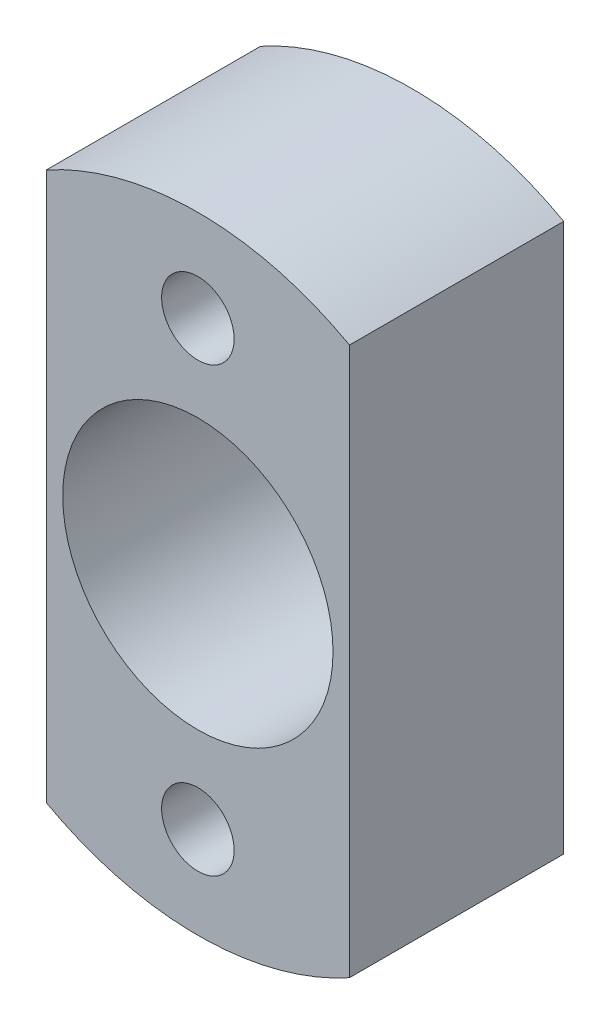
ISO-10303-21;
HEADER;
FILE_DESCRIPTION(('STEP AP214'),'2;1');
FILE_NAME('part.step','',(''),(''),'','','');
FILE_SCHEMA(('AUTOMOTIVE_DESIGN { 1 0 10303 214 1 1 1 1 }'));
ENDSEC;
DATA;
#1=APPLICATION_CONTEXT('core data for automotive mechanical design processes');
#2=APPLICATION_PROTOCOL_DEFINITION('international standard','automotive_design',2000,#1);
#3=PRODUCT_CONTEXT('',#1,'mechanical');
#4=PRODUCT('Part','Part','',(#3));
#5=PRODUCT_RELATED_PRODUCT_CATEGORY('part','',(#4));
#6=PRODUCT_DEFINITION_FORMATION('','',#4);
#7=PRODUCT_DEFINITION_CONTEXT('part definition',#1,'design');
#8=PRODUCT_DEFINITION('design','',#6,#7);
#9=PRODUCT_DEFINITION_SHAPE('','',#8);
#10=(LENGTH_UNIT() NAMED_UNIT(*) SI_UNIT(.MILLI.,.METRE.));
#11=(NAMED_UNIT(*) PLANE_ANGLE_UNIT() SI_UNIT($,.RADIAN.));
#12=(NAMED_UNIT(*) SI_UNIT($,.STERADIAN.) SOLID_ANGLE_UNIT());
#13=UNCERTAINTY_MEASURE_WITH_UNIT(LENGTH_MEASURE(1.E-05),#10,'distance_accuracy_value','');
#14=(GEOMETRIC_REPRESENTATION_CONTEXT(3) GLOBAL_UNCERTAINTY_ASSIGNED_CONTEXT((#13)) GLOBAL_UNIT_ASSIGNED_CONTEXT((#10,
#11,#12)) REPRESENTATION_CONTEXT('',''));
#15=CARTESIAN_POINT('',(0.,0.,0.));
#16=DIRECTION('',(0.,0.,1.));
#17=DIRECTION('',(1.,0.,0.));
#18=AXIS2_PLACEMENT_3D('',#15,#16,#17);
#19=CARTESIAN_POINT('',(0.,0.,6.5));
#20=DIRECTION('',(0.,0.,-1.));
#21=DIRECTION('',(-1.,0.,0.));
#22=AXIS2_PLACEMENT_3D('',#19,#20,#21);
#23=CYLINDRICAL_SURFACE('',#22,9.5);
#24=CARTESIAN_POINT('',(0.,0.,0.));
#25=DIRECTION('',(0.,0.,1.));
#26=DIRECTION('',(1.,0.,0.));
#27=AXIS2_PLACEMENT_3D('',#24,#25,#26);
#28=CIRCLE('',#27,9.5);
#29=CARTESIAN_POINT('',(-4.6,-8.31203946092654,0.));
#30=VERTEX_POINT('',#29);
#31=CARTESIAN_POINT('',(4.6,-8.31203946092654,0.));
#32=VERTEX_POINT('',#31);
#33=EDGE_CURVE('E110',#30,#32,#28,.T.);
#34=ORIENTED_EDGE('',*,*,#33,.T.);
#35=DIRECTION('',(0.,0.,-1.));
#36=VECTOR('',#35,1.);
#37=CARTESIAN_POINT('',(4.6,-8.31203946092654,6.5));
#38=LINE('',#37,#36);
#39=CARTESIAN_POINT('',(4.6,-8.31203946092654,6.5));
#40=VERTEX_POINT('',#39);
#41=EDGE_CURVE('E11',#40,#32,#38,.T.);
#42=ORIENTED_EDGE('',*,*,#41,.F.);
#43=CARTESIAN_POINT('',(0.,0.,6.5));
#44=DIRECTION('',(0.,0.,1.));
#45=DIRECTION('',(1.,0.,0.));
#46=AXIS2_PLACEMENT_3D('',#43,#44,#45);
#47=CIRCLE('',#46,9.5);
#48=CARTESIAN_POINT('',(-4.6,-8.31203946092654,6.5));
#49=VERTEX_POINT('',#48);
#50=EDGE_CURVE('E98',#49,#40,#47,.T.);
#51=ORIENTED_EDGE('',*,*,#50,.F.);
#52=DIRECTION('',(0.,0.,-1.));
#53=VECTOR('',#52,1.);
#54=CARTESIAN_POINT('',(-4.6,-8.31203946092654,6.5));
#55=LINE('',#54,#53);
#56=EDGE_CURVE('E106',#49,#30,#55,.T.);
#57=ORIENTED_EDGE('',*,*,#56,.T.);
#58=EDGE_LOOP('',(#34,#42,#51,#57));
#59=FACE_BOUND('',#58,.T.);
#60=ADVANCED_FACE('F47',(#59),#23,.T.);
#61=CARTESIAN_POINT('',(4.6,-8.31203946092654,6.5));
#62=DIRECTION('',(-1.,0.,0.));
#63=DIRECTION('',(0.,0.,1.));
#64=AXIS2_PLACEMENT_3D('',#61,#62,#63);
#65=PLANE('',#64);
#66=DIRECTION('',(0.,1.,0.));
#67=VECTOR('',#66,1.);
#68=CARTESIAN_POINT('',(4.6,-8.31203946092654,0.));
#69=LINE('',#68,#67);
#70=CARTESIAN_POINT('',(4.6,8.31203946092654,0.));
#71=VERTEX_POINT('',#70);
#72=EDGE_CURVE('E102',#32,#71,#69,.T.);
#73=ORIENTED_EDGE('',*,*,#72,.T.);
#74=DIRECTION('',(0.,0.,-1.));
#75=VECTOR('',#74,1.);
#76=CARTESIAN_POINT('',(4.6,8.31203946092654,6.5));
#77=LINE('',#76,#75);
#78=CARTESIAN_POINT('',(4.6,8.31203946092654,6.5));
#79=VERTEX_POINT('',#78);
#80=EDGE_CURVE('E55',#79,#71,#77,.T.);
#81=ORIENTED_EDGE('',*,*,#80,.F.);
#82=DIRECTION('',(0.,1.,0.));
#83=VECTOR('',#82,1.);
#84=CARTESIAN_POINT('',(4.6,-8.31203946092654,6.5));
#85=LINE('',#84,#83);
#86=EDGE_CURVE('E93',#40,#79,#85,.T.);
#87=ORIENTED_EDGE('',*,*,#86,.F.);
#88=ORIENTED_EDGE('',*,*,#41,.T.);
#89=EDGE_LOOP('',(#73,#81,#87,#88));
#90=FACE_BOUND('',#89,.T.);
#91=ADVANCED_FACE('F101',(#90),#65,.F.);
#92=CARTESIAN_POINT('',(0.,0.,6.5));
#93=DIRECTION('',(0.,0.,-1.));
#94=DIRECTION('',(-1.,0.,0.));
#95=AXIS2_PLACEMENT_3D('',#92,#93,#94);
#96=CYLINDRICAL_SURFACE('',#95,9.5);
#97=CARTESIAN_POINT('',(0.,0.,0.));
#98=DIRECTION('',(0.,0.,1.));
#99=DIRECTION('',(1.,0.,0.));
#100=AXIS2_PLACEMENT_3D('',#97,#98,#99);
#101=CIRCLE('',#100,9.5);
#102=CARTESIAN_POINT('',(-4.6,8.31203946092654,0.));
#103=VERTEX_POINT('',#102);
#104=EDGE_CURVE('E80',#71,#103,#101,.T.);
#105=ORIENTED_EDGE('',*,*,#104,.T.);
#106=DIRECTION('',(0.,0.,-1.));
#107=VECTOR('',#106,1.);
#108=CARTESIAN_POINT('',(-4.6,8.31203946092654,6.5));
#109=LINE('',#108,#107);
#110=CARTESIAN_POINT('',(-4.6,8.31203946092654,6.5));
#111=VERTEX_POINT('',#110);
#112=EDGE_CURVE('E103',#111,#103,#109,.T.);
#113=ORIENTED_EDGE('',*,*,#112,.F.);
#114=CARTESIAN_POINT('',(0.,0.,6.5));
#115=DIRECTION('',(0.,0.,1.));
#116=DIRECTION('',(1.,0.,0.));
#117=AXIS2_PLACEMENT_3D('',#114,#115,#116);
#118=CIRCLE('',#117,9.5);
#119=EDGE_CURVE('E96',#79,#111,#118,.T.);
#120=ORIENTED_EDGE('',*,*,#119,.F.);
#121=ORIENTED_EDGE('',*,*,#80,.T.);
#122=EDGE_LOOP('',(#105,#113,#120,#121));
#123=FACE_BOUND('',#122,.T.);
#124=ADVANCED_FACE('F104',(#123),#96,.T.);
#125=CARTESIAN_POINT('',(-4.6,-8.31203946092654,6.5));
#126=DIRECTION('',(1.,0.,0.));
#127=DIRECTION('',(0.,0.,-1.));
#128=AXIS2_PLACEMENT_3D('',#125,#126,#127);
#129=PLANE('',#128);
#130=DIRECTION('',(0.,-1.,0.));
#131=VECTOR('',#130,1.);
#132=CARTESIAN_POINT('',(-4.6,-8.31203946092654,0.));
#133=LINE('',#132,#131);
#134=EDGE_CURVE('E86',#103,#30,#133,.T.);
#135=ORIENTED_EDGE('',*,*,#134,.T.);
#136=ORIENTED_EDGE('',*,*,#56,.F.);
#137=DIRECTION('',(0.,-1.,0.));
#138=VECTOR('',#137,1.);
#139=CARTESIAN_POINT('',(-4.6,-8.31203946092654,6.5));
#140=LINE('',#139,#138);
#141=EDGE_CURVE('E63',#111,#49,#140,.T.);
#142=ORIENTED_EDGE('',*,*,#141,.F.);
#143=ORIENTED_EDGE('',*,*,#112,.T.);
#144=EDGE_LOOP('',(#135,#136,#142,#143));
#145=FACE_BOUND('',#144,.T.);
#146=ADVANCED_FACE('F118',(#145),#129,.F.);
#147=CARTESIAN_POINT('',(0.,0.,6.5));
#148=DIRECTION('',(0.,0.,1.));
#149=DIRECTION('',(1.,0.,0.));
#150=AXIS2_PLACEMENT_3D('',#147,#148,#149);
#151=PLANE('',#150);
#152=CARTESIAN_POINT('',(0.,0.,6.5));
#153=DIRECTION('',(0.,0.,1.));
#154=DIRECTION('',(1.,0.,0.));
#155=AXIS2_PLACEMENT_3D('',#152,#153,#154);
#156=CIRCLE('',#155,4.1);
#157=CARTESIAN_POINT('',(4.1,0.,6.5));
#158=VERTEX_POINT('',#157);
#159=EDGE_CURVE('E133',#158,#158,#156,.T.);
#160=ORIENTED_EDGE('',*,*,#159,.F.);
#161=EDGE_LOOP('',(#160));
#162=FACE_BOUND('',#161,.T.);
#163=CARTESIAN_POINT('',(0.,-6.715,6.5));
#164=DIRECTION('',(0.,0.,1.));
#165=DIRECTION('',(-1.,0.,0.));
#166=AXIS2_PLACEMENT_3D('',#163,#164,#165);
#167=CIRCLE('',#166,1.1);
#168=CARTESIAN_POINT('',(1.1,-6.715,6.5));
#169=VERTEX_POINT('',#168);
#170=EDGE_CURVE('E130',#169,#169,#167,.T.);
#171=ORIENTED_EDGE('',*,*,#170,.F.);
#172=EDGE_LOOP('',(#171));
#173=FACE_BOUND('',#172,.T.);
#174=CARTESIAN_POINT('',(0.,6.715,6.5));
#175=DIRECTION('',(0.,0.,1.));
#176=DIRECTION('',(1.,0.,0.));
#177=AXIS2_PLACEMENT_3D('',#174,#175,#176);
#178=CIRCLE('',#177,1.1);
#179=CARTESIAN_POINT('',(1.1,6.715,6.5));
#180=VERTEX_POINT('',#179);
#181=EDGE_CURVE('E124',#180,#180,#178,.T.);
#182=ORIENTED_EDGE('',*,*,#181,.F.);
#183=EDGE_LOOP('',(#182));
#184=FACE_BOUND('',#183,.T.);
#185=ORIENTED_EDGE('',*,*,#50,.T.);
#186=ORIENTED_EDGE('',*,*,#86,.T.);
#187=ORIENTED_EDGE('',*,*,#119,.T.);
#188=ORIENTED_EDGE('',*,*,#141,.T.);
#189=EDGE_LOOP('',(#185,#186,#187,#188));
#190=FACE_BOUND('',#189,.T.);
#191=ADVANCED_FACE('F94',(#162,#173,#184,#190),#151,.T.);
#192=CARTESIAN_POINT('',(0.,0.,0.));
#193=DIRECTION('',(0.,0.,1.));
#194=DIRECTION('',(1.,0.,0.));
#195=AXIS2_PLACEMENT_3D('',#192,#193,#194);
#196=PLANE('',#195);
#197=CARTESIAN_POINT('',(0.,0.,0.));
#198=DIRECTION('',(0.,0.,-1.));
#199=DIRECTION('',(-1.,0.,0.));
#200=AXIS2_PLACEMENT_3D('',#197,#198,#199);
#201=CIRCLE('',#200,4.1);
#202=CARTESIAN_POINT('',(-4.1,0.,0.));
#203=VERTEX_POINT('',#202);
#204=EDGE_CURVE('E138',#203,#203,#201,.T.);
#205=ORIENTED_EDGE('',*,*,#204,.F.);
#206=EDGE_LOOP('',(#205));
#207=FACE_BOUND('',#206,.T.);
#208=CARTESIAN_POINT('',(0.,-6.715,0.));
#209=DIRECTION('',(0.,0.,1.));
#210=DIRECTION('',(-1.,0.,0.));
#211=AXIS2_PLACEMENT_3D('',#208,#209,#210);
#212=CIRCLE('',#211,1.1);
#213=CARTESIAN_POINT('',(1.1,-6.715,0.));
#214=VERTEX_POINT('',#213);
#215=EDGE_CURVE('E127',#214,#214,#212,.T.);
#216=ORIENTED_EDGE('',*,*,#215,.T.);
#217=EDGE_LOOP('',(#216));
#218=FACE_BOUND('',#217,.T.);
#219=CARTESIAN_POINT('',(0.,6.715,0.));
#220=DIRECTION('',(0.,0.,1.));
#221=DIRECTION('',(1.,0.,0.));
#222=AXIS2_PLACEMENT_3D('',#219,#220,#221);
#223=CIRCLE('',#222,1.1);
#224=CARTESIAN_POINT('',(1.1,6.715,0.));
#225=VERTEX_POINT('',#224);
#226=EDGE_CURVE('E113',#225,#225,#223,.T.);
#227=ORIENTED_EDGE('',*,*,#226,.T.);
#228=EDGE_LOOP('',(#227));
#229=FACE_BOUND('',#228,.T.);
#230=ORIENTED_EDGE('',*,*,#33,.F.);
#231=ORIENTED_EDGE('',*,*,#134,.F.);
#232=ORIENTED_EDGE('',*,*,#104,.F.);
#233=ORIENTED_EDGE('',*,*,#72,.F.);
#234=EDGE_LOOP('',(#230,#231,#232,#233));
#235=FACE_BOUND('',#234,.T.);
#236=ADVANCED_FACE('F121',(#207,#218,#229,#235),#196,.F.);
#237=CARTESIAN_POINT('',(0.,6.715,0.));
#238=DIRECTION('',(0.,0.,1.));
#239=DIRECTION('',(1.,0.,0.));
#240=AXIS2_PLACEMENT_3D('',#237,#238,#239);
#241=CYLINDRICAL_SURFACE('',#240,1.1);
#242=CARTESIAN_POINT('',(1.1,6.715,0.));
#243=CARTESIAN_POINT('',(1.1,6.715,0.0677083333333332));
#244=CARTESIAN_POINT('',(1.1,6.715,0.135416666666667));
#245=CARTESIAN_POINT('',(1.1,6.715,0.270833333333333));
#246=CARTESIAN_POINT('',(1.1,6.715,0.338541666666667));
#247=CARTESIAN_POINT('',(1.1,6.715,0.473958333333333));
#248=CARTESIAN_POINT('',(1.1,6.715,0.541666666666667));
#249=CARTESIAN_POINT('',(1.1,6.715,0.677083333333333));
#250=CARTESIAN_POINT('',(1.1,6.715,0.744791666666667));
#251=CARTESIAN_POINT('',(1.1,6.715,0.880208333333333));
#252=CARTESIAN_POINT('',(1.1,6.715,0.947916666666667));
#253=CARTESIAN_POINT('',(1.1,6.715,1.08333333333333));
#254=CARTESIAN_POINT('',(1.1,6.715,1.15104166666667));
#255=CARTESIAN_POINT('',(1.1,6.715,1.28645833333333));
#256=CARTESIAN_POINT('',(1.1,6.715,1.35416666666667));
#257=CARTESIAN_POINT('',(1.1,6.715,1.48958333333333));
#258=CARTESIAN_POINT('',(1.1,6.715,1.55729166666667));
#259=CARTESIAN_POINT('',(1.1,6.715,1.69270833333333));
#260=CARTESIAN_POINT('',(1.1,6.715,1.76041666666667));
#261=CARTESIAN_POINT('',(1.1,6.715,1.89583333333333));
#262=CARTESIAN_POINT('',(1.1,6.715,1.96354166666667));
#263=CARTESIAN_POINT('',(1.1,6.715,2.09895833333333));
#264=CARTESIAN_POINT('',(1.1,6.715,2.16666666666667));
#265=CARTESIAN_POINT('',(1.1,6.715,2.30208333333333));
#266=CARTESIAN_POINT('',(1.1,6.715,2.36979166666667));
#267=CARTESIAN_POINT('',(1.1,6.715,2.50520833333333));
#268=CARTESIAN_POINT('',(1.1,6.715,2.57291666666667));
#269=CARTESIAN_POINT('',(1.1,6.715,2.70833333333333));
#270=CARTESIAN_POINT('',(1.1,6.715,2.77604166666667));
#271=CARTESIAN_POINT('',(1.1,6.715,2.91145833333333));
#272=CARTESIAN_POINT('',(1.1,6.715,2.97916666666667));
#273=CARTESIAN_POINT('',(1.1,6.715,3.11458333333333));
#274=CARTESIAN_POINT('',(1.1,6.715,3.18229166666667));
#275=CARTESIAN_POINT('',(1.1,6.715,3.31770833333333));
#276=CARTESIAN_POINT('',(1.1,6.715,3.38541666666667));
#277=CARTESIAN_POINT('',(1.1,6.715,3.52083333333333));
#278=CARTESIAN_POINT('',(1.1,6.715,3.58854166666667));
#279=CARTESIAN_POINT('',(1.1,6.715,3.72395833333333));
#280=CARTESIAN_POINT('',(1.1,6.715,3.79166666666667));
#281=CARTESIAN_POINT('',(1.1,6.715,3.92708333333333));
#282=CARTESIAN_POINT('',(1.1,6.715,3.99479166666667));
#283=CARTESIAN_POINT('',(1.1,6.715,4.13020833333333));
#284=CARTESIAN_POINT('',(1.1,6.715,4.19791666666667));
#285=CARTESIAN_POINT('',(1.1,6.715,4.33333333333333));
#286=CARTESIAN_POINT('',(1.1,6.715,4.40104166666667));
#287=CARTESIAN_POINT('',(1.1,6.715,4.53645833333333));
#288=CARTESIAN_POINT('',(1.1,6.715,4.60416666666667));
#289=CARTESIAN_POINT('',(1.1,6.715,4.73958333333333));
#290=CARTESIAN_POINT('',(1.1,6.715,4.80729166666667));
#291=CARTESIAN_POINT('',(1.1,6.715,4.94270833333333));
#292=CARTESIAN_POINT('',(1.1,6.715,5.01041666666667));
#293=CARTESIAN_POINT('',(1.1,6.715,5.14583333333333));
#294=CARTESIAN_POINT('',(1.1,6.715,5.21354166666667));
#295=CARTESIAN_POINT('',(1.1,6.715,5.34895833333333));
#296=CARTESIAN_POINT('',(1.1,6.715,5.41666666666667));
#297=CARTESIAN_POINT('',(1.1,6.715,5.55208333333333));
#298=CARTESIAN_POINT('',(1.1,6.715,5.61979166666667));
#299=CARTESIAN_POINT('',(1.1,6.715,5.75520833333333));
#300=CARTESIAN_POINT('',(1.1,6.715,5.82291666666667));
#301=CARTESIAN_POINT('',(1.1,6.715,5.95833333333333));
#302=CARTESIAN_POINT('',(1.1,6.715,6.02604166666667));
#303=CARTESIAN_POINT('',(1.1,6.715,6.16145833333333));
#304=CARTESIAN_POINT('',(1.1,6.715,6.22916666666667));
#305=CARTESIAN_POINT('',(1.1,6.715,6.36458333333333));
#306=CARTESIAN_POINT('',(1.1,6.715,6.43229166666667));
#307=CARTESIAN_POINT('',(1.1,6.715,6.5));
#308=B_SPLINE_CURVE_WITH_KNOTS('',3,(#242,#243,#244,#245,#246,#247,#248,#249,#250,#251,#252,
#253,#254,#255,#256,#257,#258,#259,#260,#261,#262,#263,#264,#265,#266,#267,#268,#269,#270,#271,
#272,#273,#274,#275,#276,#277,#278,#279,#280,#281,#282,#283,#284,#285,#286,#287,#288,#289,#290,
#291,#292,#293,#294,#295,#296,#297,#298,#299,#300,#301,#302,#303,#304,#305,#306,#307),
.UNSPECIFIED.,.F.,.F.,(4,2,2,2,2,2,2,2,2,2,2,2,2,2,2,2,2,2,2,2,2,2,2,2,2,2,2,2,2,2,2,2,4),(0.,
0.203125,0.40625,0.609375,0.8125,1.015625,1.21875,1.421875,1.625,1.828125,2.03125,2.234375,
2.4375,2.640625,2.84375,3.046875,3.25,3.453125,3.65625,3.859375,4.0625,4.265625,4.46875,
4.671875,4.875,5.078125,5.28125,5.484375,5.6875,5.890625,6.09375,6.296875,6.5),.UNSPECIFIED.);
#309=EDGE_CURVE('BSEAM146',#225,#180,#308,.T.);
#310=ORIENTED_EDGE('',*,*,#226,.F.);
#311=ORIENTED_EDGE('',*,*,#181,.T.);
#312=ORIENTED_EDGE('',*,*,#309,.T.);
#313=ORIENTED_EDGE('',*,*,#309,.F.);
#314=EDGE_LOOP('',(#310,#312,#311,#313));
#315=FACE_BOUND('',#314,.T.);
#316=ADVANCED_FACE('F146',(#315),#241,.F.);
#317=CARTESIAN_POINT('',(0.,-6.715,0.));
#318=DIRECTION('',(0.,0.,1.));
#319=DIRECTION('',(1.,0.,0.));
#320=AXIS2_PLACEMENT_3D('',#317,#318,#319);
#321=CYLINDRICAL_SURFACE('',#320,1.1);
#322=CARTESIAN_POINT('',(1.1,-6.715,0.));
#323=CARTESIAN_POINT('',(1.1,-6.715,0.0677083333333332));
#324=CARTESIAN_POINT('',(1.1,-6.715,0.135416666666667));
#325=CARTESIAN_POINT('',(1.1,-6.715,0.270833333333333));
#326=CARTESIAN_POINT('',(1.1,-6.715,0.338541666666667));
#327=CARTESIAN_POINT('',(1.1,-6.715,0.473958333333333));
#328=CARTESIAN_POINT('',(1.1,-6.715,0.541666666666667));
#329=CARTESIAN_POINT('',(1.1,-6.715,0.677083333333333));
#330=CARTESIAN_POINT('',(1.1,-6.715,0.744791666666667));
#331=CARTESIAN_POINT('',(1.1,-6.715,0.880208333333333));
#332=CARTESIAN_POINT('',(1.1,-6.715,0.947916666666667));
#333=CARTESIAN_POINT('',(1.1,-6.715,1.08333333333333));
#334=CARTESIAN_POINT('',(1.1,-6.715,1.15104166666667));
#335=CARTESIAN_POINT('',(1.1,-6.715,1.28645833333333));
#336=CARTESIAN_POINT('',(1.1,-6.715,1.35416666666667));
#337=CARTESIAN_POINT('',(1.1,-6.715,1.48958333333333));
#338=CARTESIAN_POINT('',(1.1,-6.715,1.55729166666667));
#339=CARTESIAN_POINT('',(1.1,-6.715,1.69270833333333));
#340=CARTESIAN_POINT('',(1.1,-6.715,1.76041666666667));
#341=CARTESIAN_POINT('',(1.1,-6.715,1.89583333333333));
#342=CARTESIAN_POINT('',(1.1,-6.715,1.96354166666667));
#343=CARTESIAN_POINT('',(1.1,-6.715,2.09895833333333));
#344=CARTESIAN_POINT('',(1.1,-6.715,2.16666666666667));
#345=CARTESIAN_POINT('',(1.1,-6.715,2.30208333333333));
#346=CARTESIAN_POINT('',(1.1,-6.715,2.36979166666667));
#347=CARTESIAN_POINT('',(1.1,-6.715,2.50520833333333));
#348=CARTESIAN_POINT('',(1.1,-6.715,2.57291666666667));
#349=CARTESIAN_POINT('',(1.1,-6.715,2.70833333333333));
#350=CARTESIAN_POINT('',(1.1,-6.715,2.77604166666667));
#351=CARTESIAN_POINT('',(1.1,-6.715,2.91145833333333));
#352=CARTESIAN_POINT('',(1.1,-6.715,2.97916666666667));
#353=CARTESIAN_POINT('',(1.1,-6.715,3.11458333333333));
#354=CARTESIAN_POINT('',(1.1,-6.715,3.18229166666667));
#355=CARTESIAN_POINT('',(1.1,-6.715,3.31770833333333));
#356=CARTESIAN_POINT('',(1.1,-6.715,3.38541666666667));
#357=CARTESIAN_POINT('',(1.1,-6.715,3.52083333333333));
#358=CARTESIAN_POINT('',(1.1,-6.715,3.58854166666667));
#359=CARTESIAN_POINT('',(1.1,-6.715,3.72395833333333));
#360=CARTESIAN_POINT('',(1.1,-6.715,3.79166666666667));
#361=CARTESIAN_POINT('',(1.1,-6.715,3.92708333333333));
#362=CARTESIAN_POINT('',(1.1,-6.715,3.99479166666667));
#363=CARTESIAN_POINT('',(1.1,-6.715,4.13020833333333));
#364=CARTESIAN_POINT('',(1.1,-6.715,4.19791666666667));
#365=CARTESIAN_POINT('',(1.1,-6.715,4.33333333333333));
#366=CARTESIAN_POINT('',(1.1,-6.715,4.40104166666667));
#367=CARTESIAN_POINT('',(1.1,-6.715,4.53645833333333));
#368=CARTESIAN_POINT('',(1.1,-6.715,4.60416666666667));
#369=CARTESIAN_POINT('',(1.1,-6.715,4.73958333333333));
#370=CARTESIAN_POINT('',(1.1,-6.715,4.80729166666667));
#371=CARTESIAN_POINT('',(1.1,-6.715,4.94270833333333));
#372=CARTESIAN_POINT('',(1.1,-6.715,5.01041666666667));
#373=CARTESIAN_POINT('',(1.1,-6.715,5.14583333333333));
#374=CARTESIAN_POINT('',(1.1,-6.715,5.21354166666667));
#375=CARTESIAN_POINT('',(1.1,-6.715,5.34895833333333));
#376=CARTESIAN_POINT('',(1.1,-6.715,5.41666666666667));
#377=CARTESIAN_POINT('',(1.1,-6.715,5.55208333333333));
#378=CARTESIAN_POINT('',(1.1,-6.715,5.61979166666667));
#379=CARTESIAN_POINT('',(1.1,-6.715,5.75520833333333));
#380=CARTESIAN_POINT('',(1.1,-6.715,5.82291666666667));
#381=CARTESIAN_POINT('',(1.1,-6.715,5.95833333333333));
#382=CARTESIAN_POINT('',(1.1,-6.715,6.02604166666667));
#383=CARTESIAN_POINT('',(1.1,-6.715,6.16145833333333));
#384=CARTESIAN_POINT('',(1.1,-6.715,6.22916666666667));
#385=CARTESIAN_POINT('',(1.1,-6.715,6.36458333333333));
#386=CARTESIAN_POINT('',(1.1,-6.715,6.43229166666667));
#387=CARTESIAN_POINT('',(1.1,-6.715,6.5));
#388=B_SPLINE_CURVE_WITH_KNOTS('',3,(#322,#323,#324,#325,#326,#327,#328,#329,#330,#331,#332,
#333,#334,#335,#336,#337,#338,#339,#340,#341,#342,#343,#344,#345,#346,#347,#348,#349,#350,#351,
#352,#353,#354,#355,#356,#357,#358,#359,#360,#361,#362,#363,#364,#365,#366,#367,#368,#369,#370,
#371,#372,#373,#374,#375,#376,#377,#378,#379,#380,#381,#382,#383,#384,#385,#386,#387),
.UNSPECIFIED.,.F.,.F.,(4,2,2,2,2,2,2,2,2,2,2,2,2,2,2,2,2,2,2,2,2,2,2,2,2,2,2,2,2,2,2,2,4),(0.,
0.203125,0.40625,0.609375,0.8125,1.015625,1.21875,1.421875,1.625,1.828125,2.03125,2.234375,
2.4375,2.640625,2.84375,3.046875,3.25,3.453125,3.65625,3.859375,4.0625,4.265625,4.46875,
4.671875,4.875,5.078125,5.28125,5.484375,5.6875,5.890625,6.09375,6.296875,6.5),.UNSPECIFIED.);
#389=EDGE_CURVE('BSEAM154',#214,#169,#388,.T.);
#390=ORIENTED_EDGE('',*,*,#215,.F.);
#391=ORIENTED_EDGE('',*,*,#170,.T.);
#392=ORIENTED_EDGE('',*,*,#389,.T.);
#393=ORIENTED_EDGE('',*,*,#389,.F.);
#394=EDGE_LOOP('',(#390,#392,#391,#393));
#395=FACE_BOUND('',#394,.T.);
#396=ADVANCED_FACE('F154',(#395),#321,.F.);
#397=CARTESIAN_POINT('',(0.,0.,24.));
#398=DIRECTION('',(0.,0.,-1.));
#399=DIRECTION('',(-1.,0.,0.));
#400=AXIS2_PLACEMENT_3D('',#397,#398,#399);
#401=CYLINDRICAL_SURFACE('',#400,4.1);
#402=ORIENTED_EDGE('',*,*,#159,.T.);
#403=EDGE_LOOP('',(#402));
#404=FACE_BOUND('',#403,.T.);
#405=ORIENTED_EDGE('',*,*,#204,.T.);
#406=EDGE_LOOP('',(#405));
#407=FACE_BOUND('',#406,.T.);
#408=ADVANCED_FACE('F142',(#404,#407),#401,.F.);
#409=CLOSED_SHELL('',(#60,#91,#124,#146,#191,#236,#316,#396,#408));
#410=MANIFOLD_SOLID_BREP('B2',#409);
#411=ADVANCED_BREP_SHAPE_REPRESENTATION('',(#18,#410),#14);
#412=SHAPE_DEFINITION_REPRESENTATION(#9,#411);
ENDSEC;
END-ISO-10303-21;
